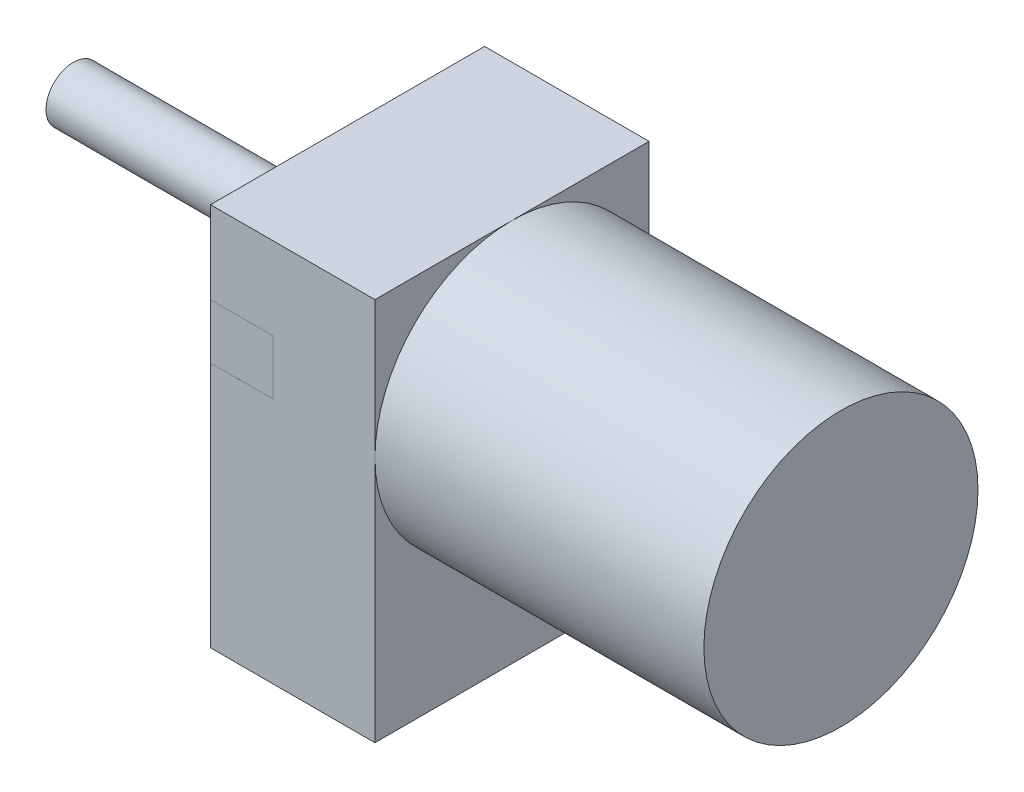
ISO-10303-21;
HEADER;
FILE_DESCRIPTION(('STEP AP214'),'2;1');
FILE_NAME('part.step','',(''),(''),'','','');
FILE_SCHEMA(('AUTOMOTIVE_DESIGN { 1 0 10303 214 1 1 1 1 }'));
ENDSEC;
DATA;
#1=APPLICATION_CONTEXT('core data for automotive mechanical design processes');
#2=APPLICATION_PROTOCOL_DEFINITION('international standard','automotive_design',2000,#1);
#3=PRODUCT_CONTEXT('',#1,'mechanical');
#4=PRODUCT('Part','Part','',(#3));
#5=PRODUCT_RELATED_PRODUCT_CATEGORY('part','',(#4));
#6=PRODUCT_DEFINITION_FORMATION('','',#4);
#7=PRODUCT_DEFINITION_CONTEXT('part definition',#1,'design');
#8=PRODUCT_DEFINITION('design','',#6,#7);
#9=PRODUCT_DEFINITION_SHAPE('','',#8);
#10=(LENGTH_UNIT() NAMED_UNIT(*) SI_UNIT(.MILLI.,.METRE.));
#11=(NAMED_UNIT(*) PLANE_ANGLE_UNIT() SI_UNIT($,.RADIAN.));
#12=(NAMED_UNIT(*) SI_UNIT($,.STERADIAN.) SOLID_ANGLE_UNIT());
#13=UNCERTAINTY_MEASURE_WITH_UNIT(LENGTH_MEASURE(1.E-05),#10,'distance_accuracy_value','');
#14=(GEOMETRIC_REPRESENTATION_CONTEXT(3) GLOBAL_UNCERTAINTY_ASSIGNED_CONTEXT((#13)) GLOBAL_UNIT_ASSIGNED_CONTEXT((#10,
#11,#12)) REPRESENTATION_CONTEXT('',''));
#15=CARTESIAN_POINT('',(0.,0.,0.));
#16=DIRECTION('',(0.,0.,1.));
#17=DIRECTION('',(1.,0.,0.));
#18=AXIS2_PLACEMENT_3D('',#15,#16,#17);
#19=CARTESIAN_POINT('',(-15.,0.,25.));
#20=DIRECTION('',(1.,0.,0.));
#21=DIRECTION('',(0.,0.,-1.));
#22=AXIS2_PLACEMENT_3D('',#19,#20,#21);
#23=PLANE('',#22);
#24=DIRECTION('',(0.,-1.,0.));
#25=VECTOR('',#24,1.);
#26=CARTESIAN_POINT('',(-15.,27.5,24.9999));
#27=LINE('',#26,#25);
#28=CARTESIAN_POINT('',(-15.,27.5,24.9999));
#29=VERTEX_POINT('',#28);
#30=CARTESIAN_POINT('',(-15.,22.5,24.9999));
#31=VERTEX_POINT('',#30);
#32=EDGE_CURVE('E169',#29,#31,#27,.T.);
#33=ORIENTED_EDGE('',*,*,#32,.F.);
#34=DIRECTION('',(0.,0.,1.));
#35=VECTOR('',#34,1.);
#36=CARTESIAN_POINT('',(-15.,27.5,24.9999));
#37=LINE('',#36,#35);
#38=CARTESIAN_POINT('',(-15.,27.5,25.));
#39=VERTEX_POINT('',#38);
#40=EDGE_CURVE('E187',#29,#39,#37,.T.);
#41=ORIENTED_EDGE('',*,*,#40,.T.);
#42=DIRECTION('',(0.,-1.,0.));
#43=VECTOR('',#42,1.);
#44=CARTESIAN_POINT('',(-15.,0.,25.));
#45=LINE('',#44,#43);
#46=CARTESIAN_POINT('',(-15.,35.,25.));
#47=VERTEX_POINT('',#46);
#48=EDGE_CURVE('E213',#47,#39,#45,.T.);
#49=ORIENTED_EDGE('',*,*,#48,.F.);
#50=DIRECTION('',(0.,0.,-1.));
#51=VECTOR('',#50,1.);
#52=CARTESIAN_POINT('',(-15.,35.,25.));
#53=LINE('',#52,#51);
#54=CARTESIAN_POINT('',(-15.,35.,0.));
#55=VERTEX_POINT('',#54);
#56=EDGE_CURVE('E232',#47,#55,#53,.T.);
#57=ORIENTED_EDGE('',*,*,#56,.T.);
#58=DIRECTION('',(0.,-1.,0.));
#59=VECTOR('',#58,1.);
#60=CARTESIAN_POINT('',(-15.,0.,0.));
#61=LINE('',#60,#59);
#62=CARTESIAN_POINT('',(-15.,0.,0.));
#63=VERTEX_POINT('',#62);
#64=EDGE_CURVE('E223',#55,#63,#61,.T.);
#65=ORIENTED_EDGE('',*,*,#64,.T.);
#66=DIRECTION('',(0.,0.,-1.));
#67=VECTOR('',#66,1.);
#68=CARTESIAN_POINT('',(-15.,0.,25.));
#69=LINE('',#68,#67);
#70=CARTESIAN_POINT('',(-15.,0.,25.));
#71=VERTEX_POINT('',#70);
#72=EDGE_CURVE('E229',#71,#63,#69,.T.);
#73=ORIENTED_EDGE('',*,*,#72,.F.);
#74=CARTESIAN_POINT('',(-15.,22.5,25.));
#75=VERTEX_POINT('',#74);
#76=EDGE_CURVE('E212',#75,#71,#45,.T.);
#77=ORIENTED_EDGE('',*,*,#76,.F.);
#78=DIRECTION('',(0.,0.,1.));
#79=VECTOR('',#78,1.);
#80=CARTESIAN_POINT('',(-15.,22.5,24.9999));
#81=LINE('',#80,#79);
#82=EDGE_CURVE('E54',#31,#75,#81,.T.);
#83=ORIENTED_EDGE('',*,*,#82,.F.);
#84=EDGE_LOOP('',(#33,#41,#49,#57,#65,#73,#77,#83));
#85=FACE_BOUND('',#84,.T.);
#86=CARTESIAN_POINT('',(-15.,25.,12.5));
#87=DIRECTION('',(1.,0.,0.));
#88=DIRECTION('',(0.,0.,-1.));
#89=AXIS2_PLACEMENT_3D('',#86,#87,#88);
#90=CIRCLE('',#89,2.5);
#91=CARTESIAN_POINT('',(-15.,25.,10.));
#92=VERTEX_POINT('',#91);
#93=EDGE_CURVE('E11',#92,#92,#90,.F.);
#94=ORIENTED_EDGE('',*,*,#93,.F.);
#95=EDGE_LOOP('',(#94));
#96=FACE_BOUND('',#95,.T.);
#97=ADVANCED_FACE('F31',(#85,#96),#23,.F.);
#98=CARTESIAN_POINT('',(0.,0.,25.));
#99=DIRECTION('',(-1.,0.,0.));
#100=DIRECTION('',(0.,0.,1.));
#101=AXIS2_PLACEMENT_3D('',#98,#99,#100);
#102=PLANE('',#101);
#103=CARTESIAN_POINT('',(0.,22.5,12.5));
#104=DIRECTION('',(1.,0.,0.));
#105=DIRECTION('',(0.,0.,-1.));
#106=AXIS2_PLACEMENT_3D('',#103,#104,#105);
#107=CIRCLE('',#106,12.5);
#108=CARTESIAN_POINT('',(0.,22.5,0.));
#109=VERTEX_POINT('',#108);
#110=CARTESIAN_POINT('',(0.,35.,12.5));
#111=VERTEX_POINT('',#110);
#112=EDGE_CURVE('E198',#109,#111,#107,.T.);
#113=ORIENTED_EDGE('',*,*,#112,.F.);
#114=DIRECTION('',(0.,1.,0.));
#115=VECTOR('',#114,1.);
#116=CARTESIAN_POINT('',(0.,0.,0.));
#117=LINE('',#116,#115);
#118=CARTESIAN_POINT('',(0.,35.,0.));
#119=VERTEX_POINT('',#118);
#120=EDGE_CURVE('E202',#109,#119,#117,.T.);
#121=ORIENTED_EDGE('',*,*,#120,.T.);
#122=DIRECTION('',(0.,0.,-1.));
#123=VECTOR('',#122,1.);
#124=CARTESIAN_POINT('',(0.,35.,25.));
#125=LINE('',#124,#123);
#126=EDGE_CURVE('E234',#111,#119,#125,.T.);
#127=ORIENTED_EDGE('',*,*,#126,.F.);
#128=EDGE_LOOP('',(#113,#121,#127));
#129=FACE_BOUND('',#128,.T.);
#130=ADVANCED_FACE('F33',(#129),#102,.F.);
#131=CARTESIAN_POINT('',(0.,22.5,25.));
#132=VERTEX_POINT('',#131);
#133=EDGE_CURVE('E39',#111,#132,#107,.T.);
#134=ORIENTED_EDGE('',*,*,#133,.F.);
#135=CARTESIAN_POINT('',(0.,35.,25.));
#136=VERTEX_POINT('',#135);
#137=EDGE_CURVE('E235',#136,#111,#125,.T.);
#138=ORIENTED_EDGE('',*,*,#137,.F.);
#139=DIRECTION('',(0.,1.,0.));
#140=VECTOR('',#139,1.);
#141=CARTESIAN_POINT('',(0.,0.,25.));
#142=LINE('',#141,#140);
#143=EDGE_CURVE('E210',#132,#136,#142,.T.);
#144=ORIENTED_EDGE('',*,*,#143,.F.);
#145=EDGE_LOOP('',(#134,#138,#144));
#146=FACE_BOUND('',#145,.T.);
#147=ADVANCED_FACE('F278',(#146),#102,.F.);
#148=EDGE_CURVE('E205',#132,#109,#107,.T.);
#149=ORIENTED_EDGE('',*,*,#148,.F.);
#150=CARTESIAN_POINT('',(0.,0.,25.));
#151=VERTEX_POINT('',#150);
#152=EDGE_CURVE('E206',#151,#132,#142,.T.);
#153=ORIENTED_EDGE('',*,*,#152,.F.);
#154=DIRECTION('',(0.,0.,-1.));
#155=VECTOR('',#154,1.);
#156=CARTESIAN_POINT('',(0.,0.,25.));
#157=LINE('',#156,#155);
#158=CARTESIAN_POINT('',(0.,0.,0.));
#159=VERTEX_POINT('',#158);
#160=EDGE_CURVE('E218',#151,#159,#157,.T.);
#161=ORIENTED_EDGE('',*,*,#160,.T.);
#162=EDGE_CURVE('E219',#159,#109,#117,.T.);
#163=ORIENTED_EDGE('',*,*,#162,.T.);
#164=EDGE_LOOP('',(#149,#153,#161,#163));
#165=FACE_BOUND('',#164,.T.);
#166=ADVANCED_FACE('F282',(#165),#102,.F.);
#167=CARTESIAN_POINT('',(0.,35.,25.));
#168=DIRECTION('',(0.,-1.,0.));
#169=DIRECTION('',(0.,0.,-1.));
#170=AXIS2_PLACEMENT_3D('',#167,#168,#169);
#171=PLANE('',#170);
#172=DIRECTION('',(-1.,0.,0.));
#173=VECTOR('',#172,1.);
#174=CARTESIAN_POINT('',(0.,35.,0.));
#175=LINE('',#174,#173);
#176=EDGE_CURVE('E221',#119,#55,#175,.T.);
#177=ORIENTED_EDGE('',*,*,#176,.T.);
#178=ORIENTED_EDGE('',*,*,#56,.F.);
#179=DIRECTION('',(-1.,0.,0.));
#180=VECTOR('',#179,1.);
#181=CARTESIAN_POINT('',(0.,35.,25.));
#182=LINE('',#181,#180);
#183=EDGE_CURVE('E209',#136,#47,#182,.T.);
#184=ORIENTED_EDGE('',*,*,#183,.F.);
#185=ORIENTED_EDGE('',*,*,#137,.T.);
#186=ORIENTED_EDGE('',*,*,#126,.T.);
#187=EDGE_LOOP('',(#177,#178,#184,#185,#186));
#188=FACE_BOUND('',#187,.T.);
#189=ADVANCED_FACE('F243',(#188),#171,.F.);
#190=CARTESIAN_POINT('',(0.,0.,25.));
#191=DIRECTION('',(0.,1.,0.));
#192=DIRECTION('',(-1.,0.,0.));
#193=AXIS2_PLACEMENT_3D('',#190,#191,#192);
#194=PLANE('',#193);
#195=DIRECTION('',(1.,0.,0.));
#196=VECTOR('',#195,1.);
#197=CARTESIAN_POINT('',(0.,0.,0.));
#198=LINE('',#197,#196);
#199=EDGE_CURVE('E225',#63,#159,#198,.T.);
#200=ORIENTED_EDGE('',*,*,#199,.T.);
#201=ORIENTED_EDGE('',*,*,#160,.F.);
#202=DIRECTION('',(1.,0.,0.));
#203=VECTOR('',#202,1.);
#204=CARTESIAN_POINT('',(0.,0.,25.));
#205=LINE('',#204,#203);
#206=EDGE_CURVE('E216',#71,#151,#205,.T.);
#207=ORIENTED_EDGE('',*,*,#206,.F.);
#208=ORIENTED_EDGE('',*,*,#72,.T.);
#209=EDGE_LOOP('',(#200,#201,#207,#208));
#210=FACE_BOUND('',#209,.T.);
#211=ADVANCED_FACE('F262',(#210),#194,.F.);
#212=CARTESIAN_POINT('',(0.,35.,25.));
#213=DIRECTION('',(0.,0.,1.));
#214=DIRECTION('',(1.,0.,0.));
#215=AXIS2_PLACEMENT_3D('',#212,#213,#214);
#216=PLANE('',#215);
#217=DIRECTION('',(-1.,0.,0.));
#218=VECTOR('',#217,1.);
#219=CARTESIAN_POINT('',(-15.,27.5,25.));
#220=LINE('',#219,#218);
#221=CARTESIAN_POINT('',(-9.29583663060871,27.5,25.));
#222=VERTEX_POINT('',#221);
#223=EDGE_CURVE('E173',#222,#39,#220,.T.);
#224=ORIENTED_EDGE('',*,*,#223,.F.);
#225=DIRECTION('',(0.,1.,0.));
#226=VECTOR('',#225,1.);
#227=CARTESIAN_POINT('',(-9.29583663060871,27.5,25.));
#228=LINE('',#227,#226);
#229=CARTESIAN_POINT('',(-9.29583663060871,22.5,25.));
#230=VERTEX_POINT('',#229);
#231=EDGE_CURVE('E183',#230,#222,#228,.T.);
#232=ORIENTED_EDGE('',*,*,#231,.F.);
#233=DIRECTION('',(1.,0.,0.));
#234=VECTOR('',#233,1.);
#235=CARTESIAN_POINT('',(-15.,22.5,25.));
#236=LINE('',#235,#234);
#237=EDGE_CURVE('E165',#75,#230,#236,.T.);
#238=ORIENTED_EDGE('',*,*,#237,.F.);
#239=ORIENTED_EDGE('',*,*,#76,.T.);
#240=ORIENTED_EDGE('',*,*,#206,.T.);
#241=ORIENTED_EDGE('',*,*,#152,.T.);
#242=ORIENTED_EDGE('',*,*,#143,.T.);
#243=ORIENTED_EDGE('',*,*,#183,.T.);
#244=ORIENTED_EDGE('',*,*,#48,.T.);
#245=EDGE_LOOP('',(#224,#232,#238,#239,#240,#241,#242,#243,#244));
#246=FACE_BOUND('',#245,.T.);
#247=ADVANCED_FACE('F267',(#246),#216,.T.);
#248=CARTESIAN_POINT('',(0.,35.,0.));
#249=DIRECTION('',(0.,0.,1.));
#250=DIRECTION('',(1.,0.,0.));
#251=AXIS2_PLACEMENT_3D('',#248,#249,#250);
#252=PLANE('',#251);
#253=DIRECTION('',(-1.,0.,0.));
#254=VECTOR('',#253,1.);
#255=CARTESIAN_POINT('',(-9.27764774878347,22.4486941642201,0.));
#256=LINE('',#255,#254);
#257=CARTESIAN_POINT('',(-9.27764774878347,22.4486941642201,0.));
#258=VERTEX_POINT('',#257);
#259=CARTESIAN_POINT('',(-14.9818111181748,22.4486941642201,0.));
#260=VERTEX_POINT('',#259);
#261=EDGE_CURVE('E159',#258,#260,#256,.T.);
#262=ORIENTED_EDGE('',*,*,#261,.F.);
#263=DIRECTION('',(0.,-1.,0.));
#264=VECTOR('',#263,1.);
#265=CARTESIAN_POINT('',(-9.27764774878347,27.4486941642201,0.));
#266=LINE('',#265,#264);
#267=CARTESIAN_POINT('',(-9.27764774878347,27.4486941642201,0.));
#268=VERTEX_POINT('',#267);
#269=EDGE_CURVE('E46',#268,#258,#266,.T.);
#270=ORIENTED_EDGE('',*,*,#269,.F.);
#271=DIRECTION('',(1.,0.,0.));
#272=VECTOR('',#271,1.);
#273=CARTESIAN_POINT('',(-9.27764774878347,27.4486941642201,0.));
#274=LINE('',#273,#272);
#275=CARTESIAN_POINT('',(-14.9818111181748,27.4486941642201,0.));
#276=VERTEX_POINT('',#275);
#277=EDGE_CURVE('E150',#276,#268,#274,.T.);
#278=ORIENTED_EDGE('',*,*,#277,.F.);
#279=DIRECTION('',(0.,1.,0.));
#280=VECTOR('',#279,1.);
#281=CARTESIAN_POINT('',(-14.9818111181748,27.4486941642201,0.));
#282=LINE('',#281,#280);
#283=EDGE_CURVE('E153',#260,#276,#282,.T.);
#284=ORIENTED_EDGE('',*,*,#283,.F.);
#285=EDGE_LOOP('',(#262,#270,#278,#284));
#286=FACE_BOUND('',#285,.T.);
#287=ORIENTED_EDGE('',*,*,#162,.F.);
#288=ORIENTED_EDGE('',*,*,#199,.F.);
#289=ORIENTED_EDGE('',*,*,#64,.F.);
#290=ORIENTED_EDGE('',*,*,#176,.F.);
#291=ORIENTED_EDGE('',*,*,#120,.F.);
#292=EDGE_LOOP('',(#287,#288,#289,#290,#291));
#293=FACE_BOUND('',#292,.T.);
#294=ADVANCED_FACE('F252',(#286,#293),#252,.F.);
#295=CARTESIAN_POINT('',(30.,22.5,12.5));
#296=DIRECTION('',(-1.,0.,0.));
#297=DIRECTION('',(0.,0.,1.));
#298=AXIS2_PLACEMENT_3D('',#295,#296,#297);
#299=CYLINDRICAL_SURFACE('',#298,12.5);
#300=CARTESIAN_POINT('',(30.,22.5,12.5));
#301=DIRECTION('',(1.,0.,0.));
#302=DIRECTION('',(0.,0.,-1.));
#303=AXIS2_PLACEMENT_3D('',#300,#301,#302);
#304=CIRCLE('',#303,12.5);
#305=CARTESIAN_POINT('',(30.,22.5,0.));
#306=VERTEX_POINT('',#305);
#307=EDGE_CURVE('E199',#306,#306,#304,.T.);
#308=ORIENTED_EDGE('',*,*,#307,.F.);
#309=EDGE_LOOP('',(#308));
#310=FACE_BOUND('',#309,.T.);
#311=ORIENTED_EDGE('',*,*,#112,.T.);
#312=ORIENTED_EDGE('',*,*,#133,.T.);
#313=ORIENTED_EDGE('',*,*,#148,.T.);
#314=EDGE_LOOP('',(#311,#312,#313));
#315=FACE_BOUND('',#314,.T.);
#316=ADVANCED_FACE('F280',(#310,#315),#299,.T.);
#317=CARTESIAN_POINT('',(30.,22.5,12.5));
#318=DIRECTION('',(1.,0.,0.));
#319=DIRECTION('',(0.,0.,-1.));
#320=AXIS2_PLACEMENT_3D('',#317,#318,#319);
#321=PLANE('',#320);
#322=ORIENTED_EDGE('',*,*,#307,.T.);
#323=EDGE_LOOP('',(#322));
#324=FACE_BOUND('',#323,.T.);
#325=ADVANCED_FACE('F303',(#324),#321,.T.);
#326=CARTESIAN_POINT('',(-40.,25.,12.5));
#327=DIRECTION('',(1.,0.,0.));
#328=DIRECTION('',(0.,0.,-1.));
#329=AXIS2_PLACEMENT_3D('',#326,#327,#328);
#330=CYLINDRICAL_SURFACE('',#329,2.5);
#331=CARTESIAN_POINT('',(-40.,25.,12.5));
#332=DIRECTION('',(-1.,0.,0.));
#333=DIRECTION('',(0.,0.,1.));
#334=AXIS2_PLACEMENT_3D('',#331,#332,#333);
#335=CIRCLE('',#334,2.5);
#336=CARTESIAN_POINT('',(-40.,25.,15.));
#337=VERTEX_POINT('',#336);
#338=EDGE_CURVE('E190',#337,#337,#335,.T.);
#339=ORIENTED_EDGE('',*,*,#338,.F.);
#340=EDGE_LOOP('',(#339));
#341=FACE_BOUND('',#340,.T.);
#342=ORIENTED_EDGE('',*,*,#93,.T.);
#343=EDGE_LOOP('',(#342));
#344=FACE_BOUND('',#343,.T.);
#345=ADVANCED_FACE('F307',(#341,#344),#330,.T.);
#346=CARTESIAN_POINT('',(-40.,25.,12.5));
#347=DIRECTION('',(-1.,0.,0.));
#348=DIRECTION('',(0.,0.,1.));
#349=AXIS2_PLACEMENT_3D('',#346,#347,#348);
#350=PLANE('',#349);
#351=ORIENTED_EDGE('',*,*,#338,.T.);
#352=EDGE_LOOP('',(#351));
#353=FACE_BOUND('',#352,.T.);
#354=ADVANCED_FACE('F311',(#353),#350,.T.);
#355=CARTESIAN_POINT('',(-15.,27.5,24.9999));
#356=DIRECTION('',(0.,1.,0.));
#357=DIRECTION('',(0.,0.,1.));
#358=AXIS2_PLACEMENT_3D('',#355,#356,#357);
#359=PLANE('',#358);
#360=ORIENTED_EDGE('',*,*,#223,.T.);
#361=ORIENTED_EDGE('',*,*,#40,.F.);
#362=DIRECTION('',(-1.,0.,0.));
#363=VECTOR('',#362,1.);
#364=CARTESIAN_POINT('',(-15.,27.5,24.9999));
#365=LINE('',#364,#363);
#366=CARTESIAN_POINT('',(-9.29583663060871,27.5,24.9999));
#367=VERTEX_POINT('',#366);
#368=EDGE_CURVE('E179',#367,#29,#365,.T.);
#369=ORIENTED_EDGE('',*,*,#368,.F.);
#370=DIRECTION('',(0.,0.,1.));
#371=VECTOR('',#370,1.);
#372=CARTESIAN_POINT('',(-9.29583663060871,27.5,24.9999));
#373=LINE('',#372,#371);
#374=EDGE_CURVE('E191',#367,#222,#373,.T.);
#375=ORIENTED_EDGE('',*,*,#374,.T.);
#376=EDGE_LOOP('',(#360,#361,#369,#375));
#377=FACE_BOUND('',#376,.T.);
#378=ADVANCED_FACE('F275',(#377),#359,.F.);
#379=CARTESIAN_POINT('',(-9.29583663060871,27.5,24.9999));
#380=DIRECTION('',(1.,0.,0.));
#381=DIRECTION('',(0.,0.,-1.));
#382=AXIS2_PLACEMENT_3D('',#379,#380,#381);
#383=PLANE('',#382);
#384=ORIENTED_EDGE('',*,*,#231,.T.);
#385=ORIENTED_EDGE('',*,*,#374,.F.);
#386=DIRECTION('',(0.,1.,0.));
#387=VECTOR('',#386,1.);
#388=CARTESIAN_POINT('',(-9.29583663060871,27.5,24.9999));
#389=LINE('',#388,#387);
#390=CARTESIAN_POINT('',(-9.29583663060871,22.5,24.9999));
#391=VERTEX_POINT('',#390);
#392=EDGE_CURVE('E176',#391,#367,#389,.T.);
#393=ORIENTED_EDGE('',*,*,#392,.F.);
#394=DIRECTION('',(0.,0.,1.));
#395=VECTOR('',#394,1.);
#396=CARTESIAN_POINT('',(-9.29583663060871,22.5,24.9999));
#397=LINE('',#396,#395);
#398=EDGE_CURVE('E193',#391,#230,#397,.T.);
#399=ORIENTED_EDGE('',*,*,#398,.T.);
#400=EDGE_LOOP('',(#384,#385,#393,#399));
#401=FACE_BOUND('',#400,.T.);
#402=ADVANCED_FACE('F319',(#401),#383,.F.);
#403=CARTESIAN_POINT('',(-15.,22.5,24.9999));
#404=DIRECTION('',(0.,-1.,0.));
#405=DIRECTION('',(0.,0.,-1.));
#406=AXIS2_PLACEMENT_3D('',#403,#404,#405);
#407=PLANE('',#406);
#408=ORIENTED_EDGE('',*,*,#237,.T.);
#409=ORIENTED_EDGE('',*,*,#398,.F.);
#410=DIRECTION('',(1.,0.,0.));
#411=VECTOR('',#410,1.);
#412=CARTESIAN_POINT('',(-15.,22.5,24.9999));
#413=LINE('',#412,#411);
#414=EDGE_CURVE('E172',#31,#391,#413,.T.);
#415=ORIENTED_EDGE('',*,*,#414,.F.);
#416=ORIENTED_EDGE('',*,*,#82,.T.);
#417=EDGE_LOOP('',(#408,#409,#415,#416));
#418=FACE_BOUND('',#417,.T.);
#419=ADVANCED_FACE('F316',(#418),#407,.F.);
#420=CARTESIAN_POINT('',(-15.,22.5,24.9999));
#421=DIRECTION('',(0.,0.,1.));
#422=DIRECTION('',(1.,0.,0.));
#423=AXIS2_PLACEMENT_3D('',#420,#421,#422);
#424=PLANE('',#423);
#425=ORIENTED_EDGE('',*,*,#32,.T.);
#426=ORIENTED_EDGE('',*,*,#414,.T.);
#427=ORIENTED_EDGE('',*,*,#392,.T.);
#428=ORIENTED_EDGE('',*,*,#368,.T.);
#429=EDGE_LOOP('',(#425,#426,#427,#428));
#430=FACE_BOUND('',#429,.T.);
#431=ADVANCED_FACE('F271',(#430),#424,.T.);
#432=CARTESIAN_POINT('',(-9.27764774878347,27.4486941642201,0.0001));
#433=DIRECTION('',(1.,0.,0.));
#434=DIRECTION('',(0.,0.,-1.));
#435=AXIS2_PLACEMENT_3D('',#432,#433,#434);
#436=PLANE('',#435);
#437=ORIENTED_EDGE('',*,*,#269,.T.);
#438=DIRECTION('',(0.,0.,-1.));
#439=VECTOR('',#438,1.);
#440=CARTESIAN_POINT('',(-9.27764774878347,22.4486941642201,0.0001));
#441=LINE('',#440,#439);
#442=CARTESIAN_POINT('',(-9.27764774878347,22.4486941642201,0.0001));
#443=VERTEX_POINT('',#442);
#444=EDGE_CURVE('E128',#443,#258,#441,.T.);
#445=ORIENTED_EDGE('',*,*,#444,.F.);
#446=DIRECTION('',(0.,-1.,0.));
#447=VECTOR('',#446,1.);
#448=CARTESIAN_POINT('',(-9.27764774878347,27.4486941642201,0.0001));
#449=LINE('',#448,#447);
#450=CARTESIAN_POINT('',(-9.27764774878347,27.4486941642201,0.0001));
#451=VERTEX_POINT('',#450);
#452=EDGE_CURVE('E132',#451,#443,#449,.T.);
#453=ORIENTED_EDGE('',*,*,#452,.F.);
#454=DIRECTION('',(0.,0.,-1.));
#455=VECTOR('',#454,1.);
#456=CARTESIAN_POINT('',(-9.27764774878347,27.4486941642201,0.0001));
#457=LINE('',#456,#455);
#458=EDGE_CURVE('E163',#451,#268,#457,.T.);
#459=ORIENTED_EDGE('',*,*,#458,.T.);
#460=EDGE_LOOP('',(#437,#445,#453,#459));
#461=FACE_BOUND('',#460,.T.);
#462=ADVANCED_FACE('F130',(#461),#436,.F.);
#463=CARTESIAN_POINT('',(-9.27764774878347,27.4486941642201,0.0001));
#464=DIRECTION('',(0.,1.,0.));
#465=DIRECTION('',(0.,0.,1.));
#466=AXIS2_PLACEMENT_3D('',#463,#464,#465);
#467=PLANE('',#466);
#468=ORIENTED_EDGE('',*,*,#277,.T.);
#469=ORIENTED_EDGE('',*,*,#458,.F.);
#470=DIRECTION('',(1.,0.,0.));
#471=VECTOR('',#470,1.);
#472=CARTESIAN_POINT('',(-9.27764774878347,27.4486941642201,0.0001));
#473=LINE('',#472,#471);
#474=CARTESIAN_POINT('',(-14.9818111181748,27.4486941642201,0.0001));
#475=VERTEX_POINT('',#474);
#476=EDGE_CURVE('E138',#475,#451,#473,.T.);
#477=ORIENTED_EDGE('',*,*,#476,.F.);
#478=DIRECTION('',(0.,0.,-1.));
#479=VECTOR('',#478,1.);
#480=CARTESIAN_POINT('',(-14.9818111181748,27.4486941642201,0.0001));
#481=LINE('',#480,#479);
#482=EDGE_CURVE('E166',#475,#276,#481,.T.);
#483=ORIENTED_EDGE('',*,*,#482,.T.);
#484=EDGE_LOOP('',(#468,#469,#477,#483));
#485=FACE_BOUND('',#484,.T.);
#486=ADVANCED_FACE('F329',(#485),#467,.F.);
#487=CARTESIAN_POINT('',(-14.9818111181748,27.4486941642201,0.0001));
#488=DIRECTION('',(-1.,0.,0.));
#489=DIRECTION('',(0.,0.,1.));
#490=AXIS2_PLACEMENT_3D('',#487,#488,#489);
#491=PLANE('',#490);
#492=ORIENTED_EDGE('',*,*,#283,.T.);
#493=ORIENTED_EDGE('',*,*,#482,.F.);
#494=DIRECTION('',(0.,1.,0.));
#495=VECTOR('',#494,1.);
#496=CARTESIAN_POINT('',(-14.9818111181748,27.4486941642201,0.0001));
#497=LINE('',#496,#495);
#498=CARTESIAN_POINT('',(-14.9818111181748,22.4486941642201,0.0001));
#499=VERTEX_POINT('',#498);
#500=EDGE_CURVE('E146',#499,#475,#497,.T.);
#501=ORIENTED_EDGE('',*,*,#500,.F.);
#502=DIRECTION('',(0.,0.,-1.));
#503=VECTOR('',#502,1.);
#504=CARTESIAN_POINT('',(-14.9818111181748,22.4486941642201,0.0001));
#505=LINE('',#504,#503);
#506=EDGE_CURVE('E137',#499,#260,#505,.T.);
#507=ORIENTED_EDGE('',*,*,#506,.T.);
#508=EDGE_LOOP('',(#492,#493,#501,#507));
#509=FACE_BOUND('',#508,.T.);
#510=ADVANCED_FACE('F332',(#509),#491,.F.);
#511=CARTESIAN_POINT('',(-9.27764774878347,22.4486941642201,0.0001));
#512=DIRECTION('',(0.,-1.,0.));
#513=DIRECTION('',(0.,0.,-1.));
#514=AXIS2_PLACEMENT_3D('',#511,#512,#513);
#515=PLANE('',#514);
#516=ORIENTED_EDGE('',*,*,#261,.T.);
#517=ORIENTED_EDGE('',*,*,#506,.F.);
#518=DIRECTION('',(-1.,0.,0.));
#519=VECTOR('',#518,1.);
#520=CARTESIAN_POINT('',(-9.27764774878347,22.4486941642201,0.0001));
#521=LINE('',#520,#519);
#522=EDGE_CURVE('E141',#443,#499,#521,.T.);
#523=ORIENTED_EDGE('',*,*,#522,.F.);
#524=ORIENTED_EDGE('',*,*,#444,.T.);
#525=EDGE_LOOP('',(#516,#517,#523,#524));
#526=FACE_BOUND('',#525,.T.);
#527=ADVANCED_FACE('F142',(#526),#515,.F.);
#528=CARTESIAN_POINT('',(-9.27764774878347,22.4486941642201,0.0001));
#529=DIRECTION('',(0.,0.,-1.));
#530=DIRECTION('',(-1.,0.,0.));
#531=AXIS2_PLACEMENT_3D('',#528,#529,#530);
#532=PLANE('',#531);
#533=ORIENTED_EDGE('',*,*,#452,.T.);
#534=ORIENTED_EDGE('',*,*,#522,.T.);
#535=ORIENTED_EDGE('',*,*,#500,.T.);
#536=ORIENTED_EDGE('',*,*,#476,.T.);
#537=EDGE_LOOP('',(#533,#534,#535,#536));
#538=FACE_BOUND('',#537,.T.);
#539=ADVANCED_FACE('F148',(#538),#532,.T.);
#540=CLOSED_SHELL('',(#97,#130,#147,#166,#189,#211,#247,#294,#316,#325,#345,#354,#378,#402,#419,
#431,#462,#486,#510,#527,#539));
#541=MANIFOLD_SOLID_BREP('B2',#540);
#542=ADVANCED_BREP_SHAPE_REPRESENTATION('',(#18,#541),#14);
#543=SHAPE_DEFINITION_REPRESENTATION(#9,#542);
ENDSEC;
END-ISO-10303-21;
